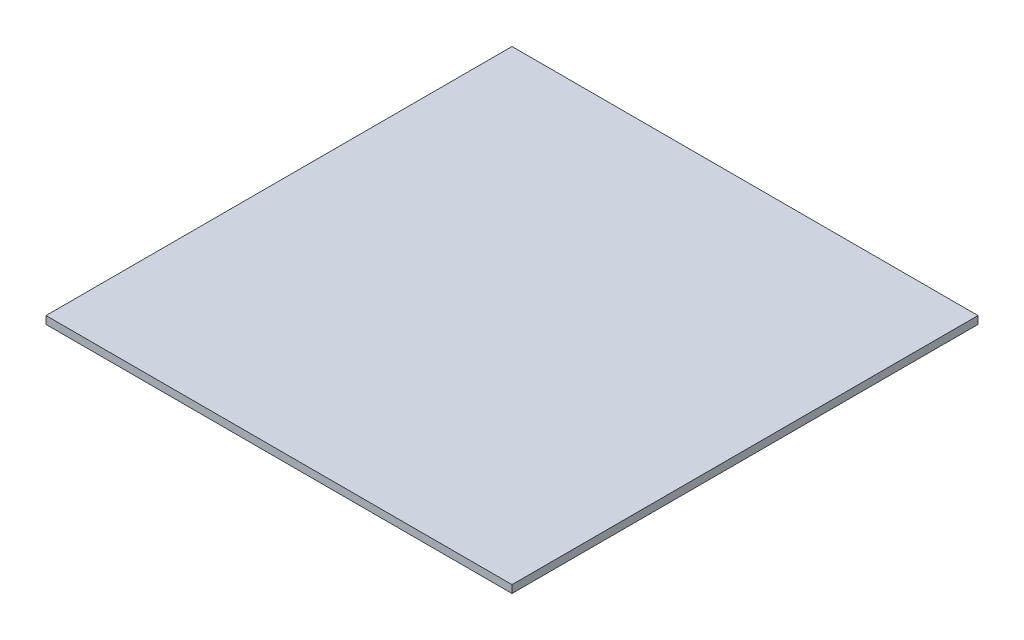
ISO-10303-21;
HEADER;
FILE_DESCRIPTION(('STEP AP214'),'2;1');
FILE_NAME('part.step','',(''),(''),'','','');
FILE_SCHEMA(('AUTOMOTIVE_DESIGN { 1 0 10303 214 1 1 1 1 }'));
ENDSEC;
DATA;
#1=APPLICATION_CONTEXT('core data for automotive mechanical design processes');
#2=APPLICATION_PROTOCOL_DEFINITION('international standard','automotive_design',2000,#1);
#3=PRODUCT_CONTEXT('',#1,'mechanical');
#4=PRODUCT('Part','Part','',(#3));
#5=PRODUCT_RELATED_PRODUCT_CATEGORY('part','',(#4));
#6=PRODUCT_DEFINITION_FORMATION('','',#4);
#7=PRODUCT_DEFINITION_CONTEXT('part definition',#1,'design');
#8=PRODUCT_DEFINITION('design','',#6,#7);
#9=PRODUCT_DEFINITION_SHAPE('','',#8);
#10=(LENGTH_UNIT() NAMED_UNIT(*) SI_UNIT(.MILLI.,.METRE.));
#11=(NAMED_UNIT(*) PLANE_ANGLE_UNIT() SI_UNIT($,.RADIAN.));
#12=(NAMED_UNIT(*) SI_UNIT($,.STERADIAN.) SOLID_ANGLE_UNIT());
#13=UNCERTAINTY_MEASURE_WITH_UNIT(LENGTH_MEASURE(1.E-05),#10,'distance_accuracy_value','');
#14=(GEOMETRIC_REPRESENTATION_CONTEXT(3) GLOBAL_UNCERTAINTY_ASSIGNED_CONTEXT((#13)) GLOBAL_UNIT_ASSIGNED_CONTEXT((#10,
#11,#12)) REPRESENTATION_CONTEXT('',''));
#15=CARTESIAN_POINT('',(0.,0.,0.));
#16=DIRECTION('',(0.,0.,1.));
#17=DIRECTION('',(1.,0.,0.));
#18=AXIS2_PLACEMENT_3D('',#15,#16,#17);
#19=CARTESIAN_POINT('',(0.,5.08,0.));
#20=DIRECTION('',(1.,0.,0.));
#21=DIRECTION('',(0.,0.,-1.));
#22=AXIS2_PLACEMENT_3D('',#19,#20,#21);
#23=PLANE('',#22);
#24=DIRECTION('',(0.,0.,1.));
#25=VECTOR('',#24,1.);
#26=CARTESIAN_POINT('',(0.,0.,0.));
#27=LINE('',#26,#25);
#28=CARTESIAN_POINT('',(0.,0.,-307.0225));
#29=VERTEX_POINT('',#28);
#30=CARTESIAN_POINT('',(0.,0.,0.));
#31=VERTEX_POINT('',#30);
#32=EDGE_CURVE('E99',#29,#31,#27,.T.);
#33=ORIENTED_EDGE('',*,*,#32,.T.);
#34=DIRECTION('',(0.,-1.,0.));
#35=VECTOR('',#34,1.);
#36=CARTESIAN_POINT('',(0.,5.08,0.));
#37=LINE('',#36,#35);
#38=CARTESIAN_POINT('',(0.,5.08,0.));
#39=VERTEX_POINT('',#38);
#40=EDGE_CURVE('E11',#39,#31,#37,.T.);
#41=ORIENTED_EDGE('',*,*,#40,.F.);
#42=DIRECTION('',(0.,0.,1.));
#43=VECTOR('',#42,1.);
#44=CARTESIAN_POINT('',(0.,5.08,0.));
#45=LINE('',#44,#43);
#46=CARTESIAN_POINT('',(0.,5.08,-307.0225));
#47=VERTEX_POINT('',#46);
#48=EDGE_CURVE('E87',#47,#39,#45,.T.);
#49=ORIENTED_EDGE('',*,*,#48,.F.);
#50=DIRECTION('',(0.,-1.,0.));
#51=VECTOR('',#50,1.);
#52=CARTESIAN_POINT('',(0.,5.08,-307.0225));
#53=LINE('',#52,#51);
#54=EDGE_CURVE('E95',#47,#29,#53,.T.);
#55=ORIENTED_EDGE('',*,*,#54,.T.);
#56=EDGE_LOOP('',(#33,#41,#49,#55));
#57=FACE_BOUND('',#56,.T.);
#58=ADVANCED_FACE('F36',(#57),#23,.F.);
#59=CARTESIAN_POINT('',(0.,5.08,0.));
#60=DIRECTION('',(0.,0.,-1.));
#61=DIRECTION('',(-1.,0.,0.));
#62=AXIS2_PLACEMENT_3D('',#59,#60,#61);
#63=PLANE('',#62);
#64=DIRECTION('',(1.,0.,0.));
#65=VECTOR('',#64,1.);
#66=CARTESIAN_POINT('',(0.,0.,0.));
#67=LINE('',#66,#65);
#68=CARTESIAN_POINT('',(307.0225,0.,0.));
#69=VERTEX_POINT('',#68);
#70=EDGE_CURVE('E91',#31,#69,#67,.T.);
#71=ORIENTED_EDGE('',*,*,#70,.T.);
#72=DIRECTION('',(0.,-1.,0.));
#73=VECTOR('',#72,1.);
#74=CARTESIAN_POINT('',(307.0225,5.08,0.));
#75=LINE('',#74,#73);
#76=CARTESIAN_POINT('',(307.0225,5.08,0.));
#77=VERTEX_POINT('',#76);
#78=EDGE_CURVE('E44',#77,#69,#75,.T.);
#79=ORIENTED_EDGE('',*,*,#78,.F.);
#80=DIRECTION('',(1.,0.,0.));
#81=VECTOR('',#80,1.);
#82=CARTESIAN_POINT('',(0.,5.08,0.));
#83=LINE('',#82,#81);
#84=EDGE_CURVE('E82',#39,#77,#83,.T.);
#85=ORIENTED_EDGE('',*,*,#84,.F.);
#86=ORIENTED_EDGE('',*,*,#40,.T.);
#87=EDGE_LOOP('',(#71,#79,#85,#86));
#88=FACE_BOUND('',#87,.T.);
#89=ADVANCED_FACE('F90',(#88),#63,.F.);
#90=CARTESIAN_POINT('',(307.0225,5.08,0.));
#91=DIRECTION('',(-1.,0.,0.));
#92=DIRECTION('',(0.,0.,1.));
#93=AXIS2_PLACEMENT_3D('',#90,#91,#92);
#94=PLANE('',#93);
#95=DIRECTION('',(0.,0.,-1.));
#96=VECTOR('',#95,1.);
#97=CARTESIAN_POINT('',(307.0225,0.,0.));
#98=LINE('',#97,#96);
#99=CARTESIAN_POINT('',(307.0225,0.,-307.0225));
#100=VERTEX_POINT('',#99);
#101=EDGE_CURVE('E69',#69,#100,#98,.T.);
#102=ORIENTED_EDGE('',*,*,#101,.T.);
#103=DIRECTION('',(0.,-1.,0.));
#104=VECTOR('',#103,1.);
#105=CARTESIAN_POINT('',(307.0225,5.08,-307.0225));
#106=LINE('',#105,#104);
#107=CARTESIAN_POINT('',(307.0225,5.08,-307.0225));
#108=VERTEX_POINT('',#107);
#109=EDGE_CURVE('E92',#108,#100,#106,.T.);
#110=ORIENTED_EDGE('',*,*,#109,.F.);
#111=DIRECTION('',(0.,0.,-1.));
#112=VECTOR('',#111,1.);
#113=CARTESIAN_POINT('',(307.0225,5.08,0.));
#114=LINE('',#113,#112);
#115=EDGE_CURVE('E85',#77,#108,#114,.T.);
#116=ORIENTED_EDGE('',*,*,#115,.F.);
#117=ORIENTED_EDGE('',*,*,#78,.T.);
#118=EDGE_LOOP('',(#102,#110,#116,#117));
#119=FACE_BOUND('',#118,.T.);
#120=ADVANCED_FACE('F93',(#119),#94,.F.);
#121=CARTESIAN_POINT('',(0.,5.08,-307.0225));
#122=DIRECTION('',(0.,0.,1.));
#123=DIRECTION('',(1.,0.,0.));
#124=AXIS2_PLACEMENT_3D('',#121,#122,#123);
#125=PLANE('',#124);
#126=DIRECTION('',(-1.,0.,0.));
#127=VECTOR('',#126,1.);
#128=CARTESIAN_POINT('',(0.,0.,-307.0225));
#129=LINE('',#128,#127);
#130=EDGE_CURVE('E75',#100,#29,#129,.T.);
#131=ORIENTED_EDGE('',*,*,#130,.T.);
#132=ORIENTED_EDGE('',*,*,#54,.F.);
#133=DIRECTION('',(-1.,0.,0.));
#134=VECTOR('',#133,1.);
#135=CARTESIAN_POINT('',(0.,5.08,-307.0225));
#136=LINE('',#135,#134);
#137=EDGE_CURVE('E52',#108,#47,#136,.T.);
#138=ORIENTED_EDGE('',*,*,#137,.F.);
#139=ORIENTED_EDGE('',*,*,#109,.T.);
#140=EDGE_LOOP('',(#131,#132,#138,#139));
#141=FACE_BOUND('',#140,.T.);
#142=ADVANCED_FACE('F106',(#141),#125,.F.);
#143=CARTESIAN_POINT('',(0.,5.08,0.));
#144=DIRECTION('',(0.,-1.,0.));
#145=DIRECTION('',(0.,0.,-1.));
#146=AXIS2_PLACEMENT_3D('',#143,#144,#145);
#147=PLANE('',#146);
#148=ORIENTED_EDGE('',*,*,#48,.T.);
#149=ORIENTED_EDGE('',*,*,#84,.T.);
#150=ORIENTED_EDGE('',*,*,#115,.T.);
#151=ORIENTED_EDGE('',*,*,#137,.T.);
#152=EDGE_LOOP('',(#148,#149,#150,#151));
#153=FACE_BOUND('',#152,.T.);
#154=ADVANCED_FACE('F83',(#153),#147,.F.);
#155=CARTESIAN_POINT('',(0.,0.,0.));
#156=DIRECTION('',(0.,-1.,0.));
#157=DIRECTION('',(0.,0.,-1.));
#158=AXIS2_PLACEMENT_3D('',#155,#156,#157);
#159=PLANE('',#158);
#160=ORIENTED_EDGE('',*,*,#32,.F.);
#161=ORIENTED_EDGE('',*,*,#130,.F.);
#162=ORIENTED_EDGE('',*,*,#101,.F.);
#163=ORIENTED_EDGE('',*,*,#70,.F.);
#164=EDGE_LOOP('',(#160,#161,#162,#163));
#165=FACE_BOUND('',#164,.T.);
#166=ADVANCED_FACE('F109',(#165),#159,.T.);
#167=CLOSED_SHELL('',(#58,#89,#120,#142,#154,#166));
#168=MANIFOLD_SOLID_BREP('B2',#167);
#169=ADVANCED_BREP_SHAPE_REPRESENTATION('',(#18,#168),#14);
#170=SHAPE_DEFINITION_REPRESENTATION(#9,#169);
ENDSEC;
END-ISO-10303-21;
